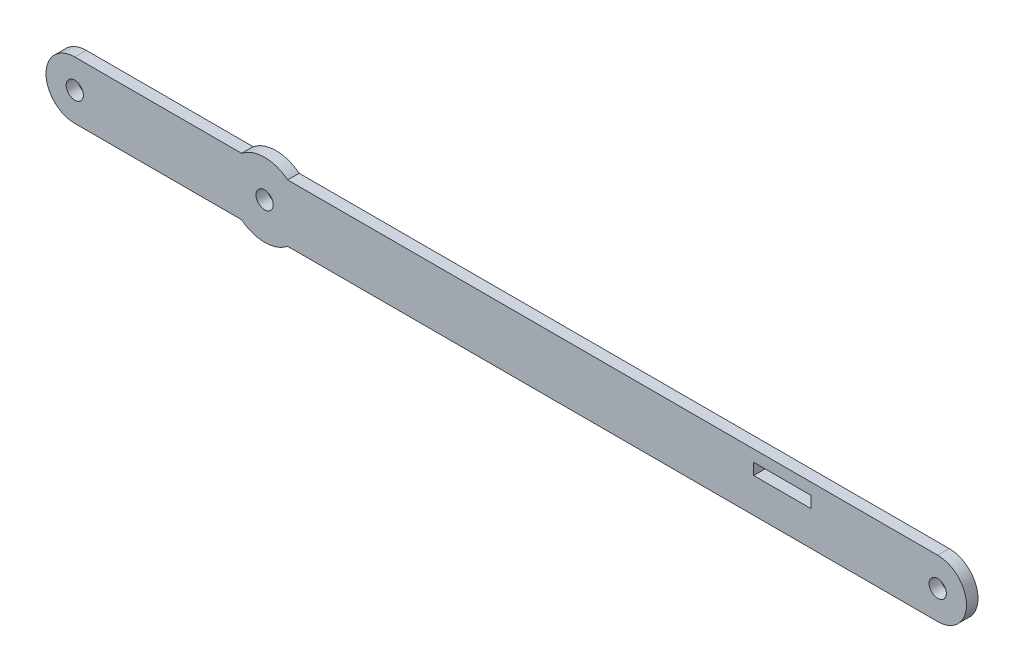
ISO-10303-21;
HEADER;
FILE_DESCRIPTION(('STEP AP214'),'2;1');
FILE_NAME('part.step','',(''),(''),'','','');
FILE_SCHEMA(('AUTOMOTIVE_DESIGN { 1 0 10303 214 1 1 1 1 }'));
ENDSEC;
DATA;
#1=APPLICATION_CONTEXT('core data for automotive mechanical design processes');
#2=APPLICATION_PROTOCOL_DEFINITION('international standard','automotive_design',2000,#1);
#3=PRODUCT_CONTEXT('',#1,'mechanical');
#4=PRODUCT('Part','Part','',(#3));
#5=PRODUCT_RELATED_PRODUCT_CATEGORY('part','',(#4));
#6=PRODUCT_DEFINITION_FORMATION('','',#4);
#7=PRODUCT_DEFINITION_CONTEXT('part definition',#1,'design');
#8=PRODUCT_DEFINITION('design','',#6,#7);
#9=PRODUCT_DEFINITION_SHAPE('','',#8);
#10=(LENGTH_UNIT() NAMED_UNIT(*) SI_UNIT(.MILLI.,.METRE.));
#11=(NAMED_UNIT(*) PLANE_ANGLE_UNIT() SI_UNIT($,.RADIAN.));
#12=(NAMED_UNIT(*) SI_UNIT($,.STERADIAN.) SOLID_ANGLE_UNIT());
#13=UNCERTAINTY_MEASURE_WITH_UNIT(LENGTH_MEASURE(1.E-05),#10,'distance_accuracy_value','');
#14=(GEOMETRIC_REPRESENTATION_CONTEXT(3) GLOBAL_UNCERTAINTY_ASSIGNED_CONTEXT((#13)) GLOBAL_UNIT_ASSIGNED_CONTEXT((#10,
#11,#12)) REPRESENTATION_CONTEXT('',''));
#15=CARTESIAN_POINT('',(0.,0.,0.));
#16=DIRECTION('',(0.,0.,1.));
#17=DIRECTION('',(1.,0.,0.));
#18=AXIS2_PLACEMENT_3D('',#15,#16,#17);
#19=CARTESIAN_POINT('',(85.,3.,0.));
#20=DIRECTION('',(0.,1.,0.));
#21=DIRECTION('',(1.,0.,0.));
#22=AXIS2_PLACEMENT_3D('',#19,#20,#21);
#23=PLANE('',#22);
#24=DIRECTION('',(-1.,0.,0.));
#25=VECTOR('',#24,1.);
#26=CARTESIAN_POINT('',(62.970989221968,3.,2.));
#27=LINE('',#26,#25);
#28=CARTESIAN_POINT('',(95.,3.,2.));
#29=VERTEX_POINT('',#28);
#30=CARTESIAN_POINT('',(85.,3.,2.));
#31=VERTEX_POINT('',#30);
#32=EDGE_CURVE('E252',#29,#31,#27,.T.);
#33=ORIENTED_EDGE('',*,*,#32,.T.);
#34=DIRECTION('',(0.,0.,1.));
#35=VECTOR('',#34,1.);
#36=CARTESIAN_POINT('',(85.,3.,0.));
#37=LINE('',#36,#35);
#38=CARTESIAN_POINT('',(85.,3.,0.));
#39=VERTEX_POINT('',#38);
#40=EDGE_CURVE('E276',#39,#31,#37,.T.);
#41=ORIENTED_EDGE('',*,*,#40,.F.);
#42=DIRECTION('',(1.,0.,0.));
#43=VECTOR('',#42,1.);
#44=CARTESIAN_POINT('',(85.,3.,0.));
#45=LINE('',#44,#43);
#46=CARTESIAN_POINT('',(95.,3.,0.));
#47=VERTEX_POINT('',#46);
#48=EDGE_CURVE('E206',#39,#47,#45,.T.);
#49=ORIENTED_EDGE('',*,*,#48,.T.);
#50=DIRECTION('',(0.,0.,1.));
#51=VECTOR('',#50,1.);
#52=CARTESIAN_POINT('',(95.,3.,0.));
#53=LINE('',#52,#51);
#54=EDGE_CURVE('E9',#47,#29,#53,.T.);
#55=ORIENTED_EDGE('',*,*,#54,.T.);
#56=EDGE_LOOP('',(#33,#41,#49,#55));
#57=FACE_BOUND('',#56,.T.);
#58=ADVANCED_FACE('F14',(#57),#23,.F.);
#59=CARTESIAN_POINT('',(95.,1.,0.));
#60=DIRECTION('',(1.,0.,0.));
#61=DIRECTION('',(0.,1.,0.));
#62=AXIS2_PLACEMENT_3D('',#59,#60,#61);
#63=PLANE('',#62);
#64=DIRECTION('',(0.,1.,0.));
#65=VECTOR('',#64,1.);
#66=CARTESIAN_POINT('',(95.,0.499999991033,2.));
#67=LINE('',#66,#65);
#68=CARTESIAN_POINT('',(95.,1.,2.));
#69=VERTEX_POINT('',#68);
#70=EDGE_CURVE('E255',#69,#29,#67,.T.);
#71=ORIENTED_EDGE('',*,*,#70,.T.);
#72=ORIENTED_EDGE('',*,*,#54,.F.);
#73=DIRECTION('',(0.,1.,0.));
#74=VECTOR('',#73,1.);
#75=CARTESIAN_POINT('',(95.,1.,0.));
#76=LINE('',#75,#74);
#77=CARTESIAN_POINT('',(95.,1.,0.));
#78=VERTEX_POINT('',#77);
#79=EDGE_CURVE('E202',#78,#47,#76,.T.);
#80=ORIENTED_EDGE('',*,*,#79,.F.);
#81=DIRECTION('',(0.,0.,1.));
#82=VECTOR('',#81,1.);
#83=CARTESIAN_POINT('',(95.,1.,0.));
#84=LINE('',#83,#82);
#85=EDGE_CURVE('E24',#78,#69,#84,.T.);
#86=ORIENTED_EDGE('',*,*,#85,.T.);
#87=EDGE_LOOP('',(#71,#72,#80,#86));
#88=FACE_BOUND('',#87,.T.);
#89=ADVANCED_FACE('F463',(#88),#63,.F.);
#90=CARTESIAN_POINT('',(85.,1.,0.));
#91=DIRECTION('',(0.,1.,0.));
#92=DIRECTION('',(1.,0.,0.));
#93=AXIS2_PLACEMENT_3D('',#90,#91,#92);
#94=PLANE('',#93);
#95=ORIENTED_EDGE('',*,*,#85,.F.);
#96=DIRECTION('',(1.,0.,0.));
#97=VECTOR('',#96,1.);
#98=CARTESIAN_POINT('',(85.,1.,0.));
#99=LINE('',#98,#97);
#100=CARTESIAN_POINT('',(85.,1.,0.));
#101=VERTEX_POINT('',#100);
#102=EDGE_CURVE('E199',#101,#78,#99,.T.);
#103=ORIENTED_EDGE('',*,*,#102,.F.);
#104=DIRECTION('',(0.,0.,1.));
#105=VECTOR('',#104,1.);
#106=CARTESIAN_POINT('',(85.,1.,0.));
#107=LINE('',#106,#105);
#108=CARTESIAN_POINT('',(85.,1.,2.));
#109=VERTEX_POINT('',#108);
#110=EDGE_CURVE('E312',#101,#109,#107,.T.);
#111=ORIENTED_EDGE('',*,*,#110,.T.);
#112=DIRECTION('',(-1.,0.,0.));
#113=VECTOR('',#112,1.);
#114=CARTESIAN_POINT('',(62.970989221968,1.,2.));
#115=LINE('',#114,#113);
#116=EDGE_CURVE('E267',#69,#109,#115,.T.);
#117=ORIENTED_EDGE('',*,*,#116,.F.);
#118=EDGE_LOOP('',(#95,#103,#111,#117));
#119=FACE_BOUND('',#118,.T.);
#120=ADVANCED_FACE('F494',(#119),#94,.T.);
#121=CARTESIAN_POINT('',(85.,1.,0.));
#122=DIRECTION('',(1.,0.,0.));
#123=DIRECTION('',(0.,1.,0.));
#124=AXIS2_PLACEMENT_3D('',#121,#122,#123);
#125=PLANE('',#124);
#126=ORIENTED_EDGE('',*,*,#110,.F.);
#127=DIRECTION('',(0.,1.,0.));
#128=VECTOR('',#127,1.);
#129=CARTESIAN_POINT('',(85.,1.,0.));
#130=LINE('',#129,#128);
#131=EDGE_CURVE('E251',#101,#39,#130,.T.);
#132=ORIENTED_EDGE('',*,*,#131,.T.);
#133=ORIENTED_EDGE('',*,*,#40,.T.);
#134=DIRECTION('',(0.,1.,0.));
#135=VECTOR('',#134,1.);
#136=CARTESIAN_POINT('',(85.,0.499999991033,2.));
#137=LINE('',#136,#135);
#138=EDGE_CURVE('E256',#109,#31,#137,.T.);
#139=ORIENTED_EDGE('',*,*,#138,.F.);
#140=EDGE_LOOP('',(#126,#132,#133,#139));
#141=FACE_BOUND('',#140,.T.);
#142=ADVANCED_FACE('F477',(#141),#125,.T.);
#143=CARTESIAN_POINT('',(117.,0.,0.));
#144=DIRECTION('',(0.,0.,-1.));
#145=DIRECTION('',(1.,0.,0.));
#146=AXIS2_PLACEMENT_3D('',#143,#144,#145);
#147=CYLINDRICAL_SURFACE('',#146,1.5);
#148=DIRECTION('',(0.,0.,1.));
#149=VECTOR('',#148,1.);
#150=CARTESIAN_POINT('',(118.5,0.,0.));
#151=LINE('',#150,#149);
#152=CARTESIAN_POINT('',(118.5,0.,0.));
#153=VERTEX_POINT('',#152);
#154=CARTESIAN_POINT('',(118.5,0.,2.));
#155=VERTEX_POINT('',#154);
#156=EDGE_CURVE('E194',#153,#155,#151,.T.);
#157=ORIENTED_EDGE('',*,*,#156,.T.);
#158=CARTESIAN_POINT('',(117.,0.,2.));
#159=DIRECTION('',(0.,0.,1.));
#160=DIRECTION('',(1.,0.,0.));
#161=AXIS2_PLACEMENT_3D('',#158,#159,#160);
#162=CIRCLE('',#161,1.5);
#163=EDGE_CURVE('E261',#155,#155,#162,.T.);
#164=ORIENTED_EDGE('',*,*,#163,.T.);
#165=ORIENTED_EDGE('',*,*,#156,.F.);
#166=CARTESIAN_POINT('',(117.,0.,0.));
#167=DIRECTION('',(0.,0.,1.));
#168=DIRECTION('',(1.,0.,0.));
#169=AXIS2_PLACEMENT_3D('',#166,#167,#168);
#170=CIRCLE('',#169,1.5);
#171=EDGE_CURVE('E196',#153,#153,#170,.T.);
#172=ORIENTED_EDGE('',*,*,#171,.F.);
#173=EDGE_LOOP('',(#157,#164,#165,#172));
#174=FACE_BOUND('',#173,.T.);
#175=ADVANCED_FACE('F328',(#174),#147,.F.);
#176=CARTESIAN_POINT('',(0.,0.,0.));
#177=DIRECTION('',(0.,0.,-1.));
#178=DIRECTION('',(1.,0.,0.));
#179=AXIS2_PLACEMENT_3D('',#176,#177,#178);
#180=CYLINDRICAL_SURFACE('',#179,1.5);
#181=DIRECTION('',(0.,0.,1.));
#182=VECTOR('',#181,1.);
#183=CARTESIAN_POINT('',(1.5,0.,0.));
#184=LINE('',#183,#182);
#185=CARTESIAN_POINT('',(1.5,0.,0.));
#186=VERTEX_POINT('',#185);
#187=CARTESIAN_POINT('',(1.5,0.,2.));
#188=VERTEX_POINT('',#187);
#189=EDGE_CURVE('E191',#186,#188,#184,.T.);
#190=ORIENTED_EDGE('',*,*,#189,.T.);
#191=CARTESIAN_POINT('',(0.,0.,2.));
#192=DIRECTION('',(0.,0.,1.));
#193=DIRECTION('',(1.,0.,0.));
#194=AXIS2_PLACEMENT_3D('',#191,#192,#193);
#195=CIRCLE('',#194,1.5);
#196=EDGE_CURVE('E257',#188,#188,#195,.T.);
#197=ORIENTED_EDGE('',*,*,#196,.T.);
#198=ORIENTED_EDGE('',*,*,#189,.F.);
#199=CARTESIAN_POINT('',(0.,0.,0.));
#200=DIRECTION('',(0.,0.,1.));
#201=DIRECTION('',(1.,0.,0.));
#202=AXIS2_PLACEMENT_3D('',#199,#200,#201);
#203=CIRCLE('',#202,1.5);
#204=EDGE_CURVE('E200',#186,#186,#203,.T.);
#205=ORIENTED_EDGE('',*,*,#204,.F.);
#206=EDGE_LOOP('',(#190,#197,#198,#205));
#207=FACE_BOUND('',#206,.T.);
#208=ADVANCED_FACE('F476',(#207),#180,.F.);
#209=CARTESIAN_POINT('',(-33.,0.,0.));
#210=DIRECTION('',(0.,0.,-1.));
#211=DIRECTION('',(1.,0.,0.));
#212=AXIS2_PLACEMENT_3D('',#209,#210,#211);
#213=CYLINDRICAL_SURFACE('',#212,1.5);
#214=DIRECTION('',(0.,0.,1.));
#215=VECTOR('',#214,1.);
#216=CARTESIAN_POINT('',(-31.5,0.,0.));
#217=LINE('',#216,#215);
#218=CARTESIAN_POINT('',(-31.5,0.,0.));
#219=VERTEX_POINT('',#218);
#220=CARTESIAN_POINT('',(-31.5,0.,2.));
#221=VERTEX_POINT('',#220);
#222=EDGE_CURVE('E195',#219,#221,#217,.T.);
#223=ORIENTED_EDGE('',*,*,#222,.T.);
#224=CARTESIAN_POINT('',(-33.,0.,2.));
#225=DIRECTION('',(0.,0.,1.));
#226=DIRECTION('',(1.,0.,0.));
#227=AXIS2_PLACEMENT_3D('',#224,#225,#226);
#228=CIRCLE('',#227,1.5);
#229=EDGE_CURVE('E241',#221,#221,#228,.T.);
#230=ORIENTED_EDGE('',*,*,#229,.T.);
#231=ORIENTED_EDGE('',*,*,#222,.F.);
#232=CARTESIAN_POINT('',(-33.,0.,0.));
#233=DIRECTION('',(0.,0.,1.));
#234=DIRECTION('',(1.,0.,0.));
#235=AXIS2_PLACEMENT_3D('',#232,#233,#234);
#236=CIRCLE('',#235,1.5);
#237=EDGE_CURVE('E17',#219,#219,#236,.T.);
#238=ORIENTED_EDGE('',*,*,#237,.F.);
#239=EDGE_LOOP('',(#223,#230,#231,#238));
#240=FACE_BOUND('',#239,.T.);
#241=ADVANCED_FACE('F506',(#240),#213,.F.);
#242=CARTESIAN_POINT('',(0.,0.,0.));
#243=DIRECTION('',(0.,0.,-1.));
#244=DIRECTION('',(1.,0.,0.));
#245=AXIS2_PLACEMENT_3D('',#242,#243,#244);
#246=CYLINDRICAL_SURFACE('',#245,6.403116253389);
#247=CARTESIAN_POINT('',(0.,0.,0.));
#248=DIRECTION('',(0.,0.,1.));
#249=DIRECTION('',(1.,0.,0.));
#250=AXIS2_PLACEMENT_3D('',#247,#248,#249);
#251=CIRCLE('',#250,6.403116253389);
#252=CARTESIAN_POINT('',(-3.999987219296,-4.999999999994,0.));
#253=VERTEX_POINT('',#252);
#254=CARTESIAN_POINT('',(3.999987219298,-4.999999999987,0.));
#255=VERTEX_POINT('',#254);
#256=EDGE_CURVE('E209',#253,#255,#251,.T.);
#257=ORIENTED_EDGE('',*,*,#256,.T.);
#258=DIRECTION('',(0.,0.,1.));
#259=VECTOR('',#258,1.);
#260=CARTESIAN_POINT('',(3.999987219298,-4.999999999987,0.));
#261=LINE('',#260,#259);
#262=CARTESIAN_POINT('',(3.999987219298,-4.999999999987,2.));
#263=VERTEX_POINT('',#262);
#264=EDGE_CURVE('E306',#255,#263,#261,.T.);
#265=ORIENTED_EDGE('',*,*,#264,.T.);
#266=CARTESIAN_POINT('',(0.,0.,2.));
#267=DIRECTION('',(0.,0.,1.));
#268=DIRECTION('',(1.,0.,0.));
#269=AXIS2_PLACEMENT_3D('',#266,#267,#268);
#270=CIRCLE('',#269,6.403116253389);
#271=CARTESIAN_POINT('',(-3.999987219296,-4.999999999994,2.));
#272=VERTEX_POINT('',#271);
#273=EDGE_CURVE('E247',#272,#263,#270,.T.);
#274=ORIENTED_EDGE('',*,*,#273,.F.);
#275=DIRECTION('',(0.,0.,1.));
#276=VECTOR('',#275,1.);
#277=CARTESIAN_POINT('',(-3.999987219296,-4.999999999994,0.));
#278=LINE('',#277,#276);
#279=EDGE_CURVE('E217',#253,#272,#278,.T.);
#280=ORIENTED_EDGE('',*,*,#279,.F.);
#281=EDGE_LOOP('',(#257,#265,#274,#280));
#282=FACE_BOUND('',#281,.T.);
#283=ADVANCED_FACE('F352',(#282),#246,.T.);
#284=CARTESIAN_POINT('',(-32.99999996905,-5.,0.));
#285=DIRECTION('',(0.,1.,0.));
#286=DIRECTION('',(1.,0.,0.));
#287=AXIS2_PLACEMENT_3D('',#284,#285,#286);
#288=PLANE('',#287);
#289=DIRECTION('',(1.,0.,0.));
#290=VECTOR('',#289,1.);
#291=CARTESIAN_POINT('',(-32.99999996905,-5.,0.));
#292=LINE('',#291,#290);
#293=CARTESIAN_POINT('',(-32.99999996905,-5.,0.));
#294=VERTEX_POINT('',#293);
#295=EDGE_CURVE('E213',#294,#253,#292,.T.);
#296=ORIENTED_EDGE('',*,*,#295,.T.);
#297=ORIENTED_EDGE('',*,*,#279,.T.);
#298=DIRECTION('',(1.,0.,0.));
#299=VECTOR('',#298,1.);
#300=CARTESIAN_POINT('',(-32.99999996905,-5.,2.));
#301=LINE('',#300,#299);
#302=CARTESIAN_POINT('',(-32.99999996905,-5.,2.));
#303=VERTEX_POINT('',#302);
#304=EDGE_CURVE('E243',#303,#272,#301,.T.);
#305=ORIENTED_EDGE('',*,*,#304,.F.);
#306=DIRECTION('',(0.,0.,1.));
#307=VECTOR('',#306,1.);
#308=CARTESIAN_POINT('',(-32.99999996905,-5.,0.));
#309=LINE('',#308,#307);
#310=EDGE_CURVE('E272',#294,#303,#309,.T.);
#311=ORIENTED_EDGE('',*,*,#310,.F.);
#312=EDGE_LOOP('',(#296,#297,#305,#311));
#313=FACE_BOUND('',#312,.T.);
#314=ADVANCED_FACE('F355',(#313),#288,.F.);
#315=CARTESIAN_POINT('',(3.999987219298,-4.999999999987,0.));
#316=DIRECTION('',(1.124E-13,1.,0.));
#317=DIRECTION('',(1.,-1.124E-13,0.));
#318=AXIS2_PLACEMENT_3D('',#315,#316,#317);
#319=PLANE('',#318);
#320=DIRECTION('',(1.,-1.124E-13,0.));
#321=VECTOR('',#320,1.);
#322=CARTESIAN_POINT('',(3.999987219298,-4.999999999987,0.));
#323=LINE('',#322,#321);
#324=CARTESIAN_POINT('',(117.00000030643,-5.,0.));
#325=VERTEX_POINT('',#324);
#326=EDGE_CURVE('E214',#255,#325,#323,.T.);
#327=ORIENTED_EDGE('',*,*,#326,.T.);
#328=DIRECTION('',(0.,0.,1.));
#329=VECTOR('',#328,1.);
#330=CARTESIAN_POINT('',(117.00000030643,-5.,0.));
#331=LINE('',#330,#329);
#332=CARTESIAN_POINT('',(117.00000030643,-5.,2.));
#333=VERTEX_POINT('',#332);
#334=EDGE_CURVE('E264',#325,#333,#331,.T.);
#335=ORIENTED_EDGE('',*,*,#334,.T.);
#336=DIRECTION('',(1.,-1.124E-13,0.));
#337=VECTOR('',#336,1.);
#338=CARTESIAN_POINT('',(3.999987219298,-4.999999999987,2.));
#339=LINE('',#338,#337);
#340=EDGE_CURVE('E242',#263,#333,#339,.T.);
#341=ORIENTED_EDGE('',*,*,#340,.F.);
#342=ORIENTED_EDGE('',*,*,#264,.F.);
#343=EDGE_LOOP('',(#327,#335,#341,#342));
#344=FACE_BOUND('',#343,.T.);
#345=ADVANCED_FACE('F349',(#344),#319,.F.);
#346=CARTESIAN_POINT('',(-33.,0.,0.));
#347=DIRECTION('',(0.,0.,-1.));
#348=DIRECTION('',(1.,0.,0.));
#349=AXIS2_PLACEMENT_3D('',#346,#347,#348);
#350=CYLINDRICAL_SURFACE('',#349,5.);
#351=CARTESIAN_POINT('',(-33.,0.,0.));
#352=DIRECTION('',(0.,0.,1.));
#353=DIRECTION('',(1.,0.,0.));
#354=AXIS2_PLACEMENT_3D('',#351,#352,#353);
#355=CIRCLE('',#354,5.);
#356=CARTESIAN_POINT('',(-33.00000026187,5.,0.));
#357=VERTEX_POINT('',#356);
#358=EDGE_CURVE('E160',#357,#294,#355,.T.);
#359=ORIENTED_EDGE('',*,*,#358,.T.);
#360=ORIENTED_EDGE('',*,*,#310,.T.);
#361=CARTESIAN_POINT('',(-33.,0.,2.));
#362=DIRECTION('',(0.,0.,1.));
#363=DIRECTION('',(1.,0.,0.));
#364=AXIS2_PLACEMENT_3D('',#361,#362,#363);
#365=CIRCLE('',#364,5.);
#366=CARTESIAN_POINT('',(-33.00000026187,5.,2.));
#367=VERTEX_POINT('',#366);
#368=EDGE_CURVE('E248',#367,#303,#365,.T.);
#369=ORIENTED_EDGE('',*,*,#368,.F.);
#370=DIRECTION('',(0.,0.,1.));
#371=VECTOR('',#370,1.);
#372=CARTESIAN_POINT('',(-33.00000026187,5.,0.));
#373=LINE('',#372,#371);
#374=EDGE_CURVE('E189',#357,#367,#373,.T.);
#375=ORIENTED_EDGE('',*,*,#374,.F.);
#376=EDGE_LOOP('',(#359,#360,#369,#375));
#377=FACE_BOUND('',#376,.T.);
#378=ADVANCED_FACE('F357',(#377),#350,.T.);
#379=CARTESIAN_POINT('',(117.,0.,0.));
#380=DIRECTION('',(0.,0.,-1.));
#381=DIRECTION('',(1.,0.,0.));
#382=AXIS2_PLACEMENT_3D('',#379,#380,#381);
#383=CYLINDRICAL_SURFACE('',#382,5.);
#384=CARTESIAN_POINT('',(117.,0.,0.));
#385=DIRECTION('',(0.,0.,1.));
#386=DIRECTION('',(1.,0.,0.));
#387=AXIS2_PLACEMENT_3D('',#384,#385,#386);
#388=CIRCLE('',#387,5.);
#389=CARTESIAN_POINT('',(116.99998751211,4.999999999984,0.));
#390=VERTEX_POINT('',#389);
#391=EDGE_CURVE('E165',#325,#390,#388,.T.);
#392=ORIENTED_EDGE('',*,*,#391,.T.);
#393=DIRECTION('',(0.,0.,1.));
#394=VECTOR('',#393,1.);
#395=CARTESIAN_POINT('',(116.99998751211,4.999999999984,0.));
#396=LINE('',#395,#394);
#397=CARTESIAN_POINT('',(116.99998751211,4.999999999984,2.));
#398=VERTEX_POINT('',#397);
#399=EDGE_CURVE('E220',#390,#398,#396,.T.);
#400=ORIENTED_EDGE('',*,*,#399,.T.);
#401=CARTESIAN_POINT('',(117.,0.,2.));
#402=DIRECTION('',(0.,0.,1.));
#403=DIRECTION('',(1.,0.,0.));
#404=AXIS2_PLACEMENT_3D('',#401,#402,#403);
#405=CIRCLE('',#404,5.);
#406=EDGE_CURVE('E238',#333,#398,#405,.T.);
#407=ORIENTED_EDGE('',*,*,#406,.F.);
#408=ORIENTED_EDGE('',*,*,#334,.F.);
#409=EDGE_LOOP('',(#392,#400,#407,#408));
#410=FACE_BOUND('',#409,.T.);
#411=ADVANCED_FACE('F334',(#410),#383,.T.);
#412=CARTESIAN_POINT('',(40.941978443937,-1.793315637E-08,2.));
#413=DIRECTION('',(0.,0.,1.));
#414=DIRECTION('',(1.,0.,0.));
#415=AXIS2_PLACEMENT_3D('',#412,#413,#414);
#416=PLANE('',#415);
#417=ORIENTED_EDGE('',*,*,#116,.T.);
#418=ORIENTED_EDGE('',*,*,#138,.T.);
#419=ORIENTED_EDGE('',*,*,#32,.F.);
#420=ORIENTED_EDGE('',*,*,#70,.F.);
#421=EDGE_LOOP('',(#417,#418,#419,#420));
#422=FACE_BOUND('',#421,.T.);
#423=ORIENTED_EDGE('',*,*,#163,.F.);
#424=EDGE_LOOP('',(#423));
#425=FACE_BOUND('',#424,.T.);
#426=ORIENTED_EDGE('',*,*,#196,.F.);
#427=EDGE_LOOP('',(#426));
#428=FACE_BOUND('',#427,.T.);
#429=ORIENTED_EDGE('',*,*,#229,.F.);
#430=EDGE_LOOP('',(#429));
#431=FACE_BOUND('',#430,.T.);
#432=CARTESIAN_POINT('',(0.,0.,2.));
#433=DIRECTION('',(0.,0.,1.));
#434=DIRECTION('',(1.,0.,0.));
#435=AXIS2_PLACEMENT_3D('',#432,#433,#434);
#436=CIRCLE('',#435,6.403116436312);
#437=CARTESIAN_POINT('',(3.999987512116,4.999999999986,2.));
#438=VERTEX_POINT('',#437);
#439=CARTESIAN_POINT('',(-3.999987512116,4.999999999993,2.));
#440=VERTEX_POINT('',#439);
#441=EDGE_CURVE('E176',#438,#440,#436,.T.);
#442=ORIENTED_EDGE('',*,*,#441,.T.);
#443=DIRECTION('',(1.,0.,0.));
#444=VECTOR('',#443,1.);
#445=CARTESIAN_POINT('',(-33.00000026187,5.,2.));
#446=LINE('',#445,#444);
#447=EDGE_CURVE('E166',#367,#440,#446,.T.);
#448=ORIENTED_EDGE('',*,*,#447,.F.);
#449=ORIENTED_EDGE('',*,*,#368,.T.);
#450=ORIENTED_EDGE('',*,*,#304,.T.);
#451=ORIENTED_EDGE('',*,*,#273,.T.);
#452=ORIENTED_EDGE('',*,*,#340,.T.);
#453=ORIENTED_EDGE('',*,*,#406,.T.);
#454=DIRECTION('',(1.,0.,0.));
#455=VECTOR('',#454,1.);
#456=CARTESIAN_POINT('',(3.999987512113,4.999999999984,2.));
#457=LINE('',#456,#455);
#458=EDGE_CURVE('E221',#438,#398,#457,.T.);
#459=ORIENTED_EDGE('',*,*,#458,.F.);
#460=EDGE_LOOP('',(#442,#448,#449,#450,#451,#452,#453,#459));
#461=FACE_BOUND('',#460,.T.);
#462=ADVANCED_FACE('F331',(#422,#425,#428,#431,#461),#416,.T.);
#463=CARTESIAN_POINT('',(40.941978443937,-1.793315637E-08,0.));
#464=DIRECTION('',(0.,0.,1.));
#465=DIRECTION('',(1.,0.,0.));
#466=AXIS2_PLACEMENT_3D('',#463,#464,#465);
#467=PLANE('',#466);
#468=ORIENTED_EDGE('',*,*,#102,.T.);
#469=ORIENTED_EDGE('',*,*,#79,.T.);
#470=ORIENTED_EDGE('',*,*,#48,.F.);
#471=ORIENTED_EDGE('',*,*,#131,.F.);
#472=EDGE_LOOP('',(#468,#469,#470,#471));
#473=FACE_BOUND('',#472,.T.);
#474=ORIENTED_EDGE('',*,*,#171,.T.);
#475=EDGE_LOOP('',(#474));
#476=FACE_BOUND('',#475,.T.);
#477=ORIENTED_EDGE('',*,*,#204,.T.);
#478=EDGE_LOOP('',(#477));
#479=FACE_BOUND('',#478,.T.);
#480=ORIENTED_EDGE('',*,*,#237,.T.);
#481=EDGE_LOOP('',(#480));
#482=FACE_BOUND('',#481,.T.);
#483=DIRECTION('',(1.,0.,0.));
#484=VECTOR('',#483,1.);
#485=CARTESIAN_POINT('',(3.999987512113,4.999999999984,0.));
#486=LINE('',#485,#484);
#487=CARTESIAN_POINT('',(3.999987512116,4.999999999986,0.));
#488=VERTEX_POINT('',#487);
#489=EDGE_CURVE('E218',#488,#390,#486,.T.);
#490=ORIENTED_EDGE('',*,*,#489,.T.);
#491=ORIENTED_EDGE('',*,*,#391,.F.);
#492=ORIENTED_EDGE('',*,*,#326,.F.);
#493=ORIENTED_EDGE('',*,*,#256,.F.);
#494=ORIENTED_EDGE('',*,*,#295,.F.);
#495=ORIENTED_EDGE('',*,*,#358,.F.);
#496=DIRECTION('',(1.,0.,0.));
#497=VECTOR('',#496,1.);
#498=CARTESIAN_POINT('',(-33.00000026187,5.,0.));
#499=LINE('',#498,#497);
#500=CARTESIAN_POINT('',(-3.999987512116,4.999999999993,0.));
#501=VERTEX_POINT('',#500);
#502=EDGE_CURVE('E152',#357,#501,#499,.T.);
#503=ORIENTED_EDGE('',*,*,#502,.T.);
#504=CARTESIAN_POINT('',(0.,0.,0.));
#505=DIRECTION('',(0.,0.,1.));
#506=DIRECTION('',(1.,0.,0.));
#507=AXIS2_PLACEMENT_3D('',#504,#505,#506);
#508=CIRCLE('',#507,6.403116436312);
#509=EDGE_CURVE('E157',#488,#501,#508,.T.);
#510=ORIENTED_EDGE('',*,*,#509,.F.);
#511=EDGE_LOOP('',(#490,#491,#492,#493,#494,#495,#503,#510));
#512=FACE_BOUND('',#511,.T.);
#513=ADVANCED_FACE('F155',(#473,#476,#479,#482,#512),#467,.F.);
#514=CARTESIAN_POINT('',(-33.00000026187,5.,0.));
#515=DIRECTION('',(0.,1.,0.));
#516=DIRECTION('',(1.,0.,0.));
#517=AXIS2_PLACEMENT_3D('',#514,#515,#516);
#518=PLANE('',#517);
#519=ORIENTED_EDGE('',*,*,#374,.T.);
#520=ORIENTED_EDGE('',*,*,#447,.T.);
#521=DIRECTION('',(0.,0.,1.));
#522=VECTOR('',#521,1.);
#523=CARTESIAN_POINT('',(-3.999987512116,4.999999999993,0.));
#524=LINE('',#523,#522);
#525=EDGE_CURVE('E169',#501,#440,#524,.T.);
#526=ORIENTED_EDGE('',*,*,#525,.F.);
#527=ORIENTED_EDGE('',*,*,#502,.F.);
#528=EDGE_LOOP('',(#519,#520,#526,#527));
#529=FACE_BOUND('',#528,.T.);
#530=ADVANCED_FACE('F170',(#529),#518,.T.);
#531=CARTESIAN_POINT('',(3.999987512113,4.999999999984,0.));
#532=DIRECTION('',(0.,1.,0.));
#533=DIRECTION('',(1.,0.,0.));
#534=AXIS2_PLACEMENT_3D('',#531,#532,#533);
#535=PLANE('',#534);
#536=DIRECTION('',(0.,0.,1.));
#537=VECTOR('',#536,1.);
#538=CARTESIAN_POINT('',(3.999987512116,4.999999999986,0.));
#539=LINE('',#538,#537);
#540=EDGE_CURVE('E181',#488,#438,#539,.T.);
#541=ORIENTED_EDGE('',*,*,#540,.T.);
#542=ORIENTED_EDGE('',*,*,#458,.T.);
#543=ORIENTED_EDGE('',*,*,#399,.F.);
#544=ORIENTED_EDGE('',*,*,#489,.F.);
#545=EDGE_LOOP('',(#541,#542,#543,#544));
#546=FACE_BOUND('',#545,.T.);
#547=ADVANCED_FACE('F345',(#546),#535,.T.);
#548=CARTESIAN_POINT('',(0.,0.,0.));
#549=DIRECTION('',(0.,0.,-1.));
#550=DIRECTION('',(1.,0.,0.));
#551=AXIS2_PLACEMENT_3D('',#548,#549,#550);
#552=CYLINDRICAL_SURFACE('',#551,6.403116436312);
#553=ORIENTED_EDGE('',*,*,#509,.T.);
#554=ORIENTED_EDGE('',*,*,#525,.T.);
#555=ORIENTED_EDGE('',*,*,#441,.F.);
#556=ORIENTED_EDGE('',*,*,#540,.F.);
#557=EDGE_LOOP('',(#553,#554,#555,#556));
#558=FACE_BOUND('',#557,.T.);
#559=ADVANCED_FACE('F179',(#558),#552,.T.);
#560=CLOSED_SHELL('',(#58,#89,#120,#142,#175,#208,#241,#283,#314,#345,#378,#411,#462,#513,#530,
#547,#559));
#561=MANIFOLD_SOLID_BREP('B1',#560);
#562=ADVANCED_BREP_SHAPE_REPRESENTATION('',(#18,#561),#14);
#563=SHAPE_DEFINITION_REPRESENTATION(#9,#562);
ENDSEC;
END-ISO-10303-21;
